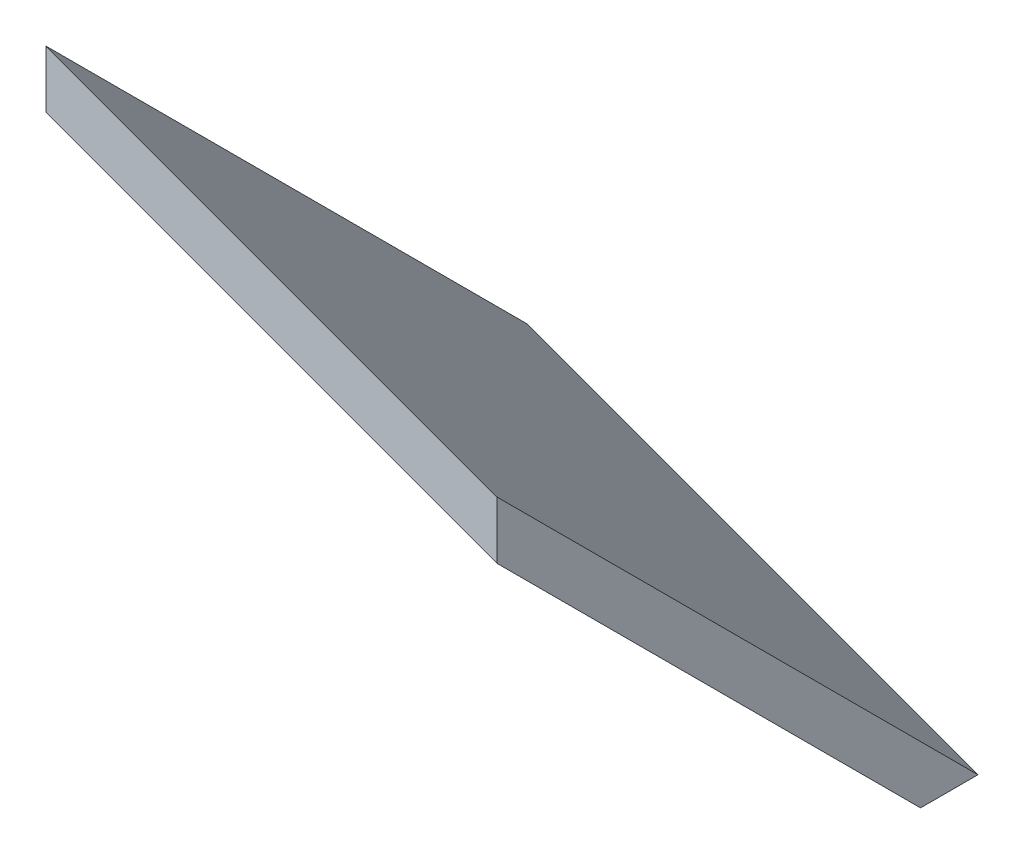
ISO-10303-21;
HEADER;
FILE_DESCRIPTION(('STEP AP214'),'2;1');
FILE_NAME('part.step','',(''),(''),'','','');
FILE_SCHEMA(('AUTOMOTIVE_DESIGN { 1 0 10303 214 1 1 1 1 }'));
ENDSEC;
DATA;
#1=APPLICATION_CONTEXT('core data for automotive mechanical design processes');
#2=APPLICATION_PROTOCOL_DEFINITION('international standard','automotive_design',2000,#1);
#3=PRODUCT_CONTEXT('',#1,'mechanical');
#4=PRODUCT('Part','Part','',(#3));
#5=PRODUCT_RELATED_PRODUCT_CATEGORY('part','',(#4));
#6=PRODUCT_DEFINITION_FORMATION('','',#4);
#7=PRODUCT_DEFINITION_CONTEXT('part definition',#1,'design');
#8=PRODUCT_DEFINITION('design','',#6,#7);
#9=PRODUCT_DEFINITION_SHAPE('','',#8);
#10=(LENGTH_UNIT() NAMED_UNIT(*) SI_UNIT(.MILLI.,.METRE.));
#11=(NAMED_UNIT(*) PLANE_ANGLE_UNIT() SI_UNIT($,.RADIAN.));
#12=(NAMED_UNIT(*) SI_UNIT($,.STERADIAN.) SOLID_ANGLE_UNIT());
#13=UNCERTAINTY_MEASURE_WITH_UNIT(LENGTH_MEASURE(1.E-05),#10,'distance_accuracy_value','');
#14=(GEOMETRIC_REPRESENTATION_CONTEXT(3) GLOBAL_UNCERTAINTY_ASSIGNED_CONTEXT((#13)) GLOBAL_UNIT_ASSIGNED_CONTEXT((#10,
#11,#12)) REPRESENTATION_CONTEXT('',''));
#15=CARTESIAN_POINT('',(0.,0.,0.));
#16=DIRECTION('',(0.,0.,1.));
#17=DIRECTION('',(1.,0.,0.));
#18=AXIS2_PLACEMENT_3D('',#15,#16,#17);
#19=CARTESIAN_POINT('',(0.,0.,0.));
#20=DIRECTION('',(1.,0.,0.));
#21=DIRECTION('',(0.,0.,-1.));
#22=AXIS2_PLACEMENT_3D('',#19,#20,#21);
#23=PLANE('',#22);
#24=DIRECTION('',(0.,-1.,0.));
#25=VECTOR('',#24,1.);
#26=CARTESIAN_POINT('',(0.,129.8,0.));
#27=LINE('',#26,#25);
#28=CARTESIAN_POINT('',(0.,129.8,0.));
#29=VERTEX_POINT('',#28);
#30=CARTESIAN_POINT('',(0.,114.3,0.));
#31=VERTEX_POINT('',#30);
#32=EDGE_CURVE('E92',#29,#31,#27,.T.);
#33=ORIENTED_EDGE('',*,*,#32,.T.);
#34=DIRECTION('',(0.,-0.707106781186547,-0.707106781186548));
#35=VECTOR('',#34,1.);
#36=CARTESIAN_POINT('',(0.,114.3,0.));
#37=LINE('',#36,#35);
#38=CARTESIAN_POINT('',(0.,0.,-114.3));
#39=VERTEX_POINT('',#38);
#40=EDGE_CURVE('E85',#31,#39,#37,.T.);
#41=ORIENTED_EDGE('',*,*,#40,.T.);
#42=DIRECTION('',(0.,0.,-1.));
#43=VECTOR('',#42,1.);
#44=CARTESIAN_POINT('',(0.,0.,-114.3));
#45=LINE('',#44,#43);
#46=CARTESIAN_POINT('',(0.,0.,-129.8));
#47=VERTEX_POINT('',#46);
#48=EDGE_CURVE('E80',#39,#47,#45,.T.);
#49=ORIENTED_EDGE('',*,*,#48,.T.);
#50=DIRECTION('',(0.,0.707106781186547,0.707106781186548));
#51=VECTOR('',#50,1.);
#52=CARTESIAN_POINT('',(0.,0.,-129.8));
#53=LINE('',#52,#51);
#54=EDGE_CURVE('E75',#47,#29,#53,.T.);
#55=ORIENTED_EDGE('',*,*,#54,.T.);
#56=EDGE_LOOP('',(#33,#41,#49,#55));
#57=FACE_BOUND('',#56,.T.);
#58=ADVANCED_FACE('F39',(#57),#23,.T.);
#59=CARTESIAN_POINT('',(-166.13924212172,0.,-44.5168757576337));
#60=DIRECTION('',(1.,0.,0.));
#61=DIRECTION('',(0.,0.,-1.));
#62=AXIS2_PLACEMENT_3D('',#59,#60,#61);
#63=PLANE('',#62);
#64=DIRECTION('',(0.,-1.,0.));
#65=VECTOR('',#64,1.);
#66=CARTESIAN_POINT('',(-166.13924212172,129.8,-44.5168757576336));
#67=LINE('',#66,#65);
#68=CARTESIAN_POINT('',(-166.13924212172,129.8,-44.5168757576336));
#69=VERTEX_POINT('',#68);
#70=CARTESIAN_POINT('',(-166.13924212172,114.3,-44.5168757576337));
#71=VERTEX_POINT('',#70);
#72=EDGE_CURVE('E103',#69,#71,#67,.T.);
#73=ORIENTED_EDGE('',*,*,#72,.F.);
#74=DIRECTION('',(0.,0.707106781186547,0.707106781186548));
#75=VECTOR('',#74,1.);
#76=CARTESIAN_POINT('',(-166.13924212172,0.,-174.316875757634));
#77=LINE('',#76,#75);
#78=CARTESIAN_POINT('',(-166.13924212172,0.,-174.316875757634));
#79=VERTEX_POINT('',#78);
#80=EDGE_CURVE('E11',#79,#69,#77,.T.);
#81=ORIENTED_EDGE('',*,*,#80,.F.);
#82=DIRECTION('',(0.,0.,-1.));
#83=VECTOR('',#82,1.);
#84=CARTESIAN_POINT('',(-166.13924212172,0.,-158.816875757634));
#85=LINE('',#84,#83);
#86=CARTESIAN_POINT('',(-166.13924212172,0.,-158.816875757634));
#87=VERTEX_POINT('',#86);
#88=EDGE_CURVE('E54',#87,#79,#85,.T.);
#89=ORIENTED_EDGE('',*,*,#88,.F.);
#90=DIRECTION('',(0.,-0.707106781186547,-0.707106781186548));
#91=VECTOR('',#90,1.);
#92=CARTESIAN_POINT('',(-166.13924212172,114.3,-44.5168757576337));
#93=LINE('',#92,#91);
#94=EDGE_CURVE('E63',#71,#87,#93,.T.);
#95=ORIENTED_EDGE('',*,*,#94,.F.);
#96=EDGE_LOOP('',(#73,#81,#89,#95));
#97=FACE_BOUND('',#96,.T.);
#98=ADVANCED_FACE('F132',(#97),#63,.F.);
#99=CARTESIAN_POINT('',(0.,129.8,0.));
#100=DIRECTION('',(0.258819045102521,0.,-0.965925826289068));
#101=DIRECTION('',(-0.965925826289068,0.,-0.258819045102521));
#102=AXIS2_PLACEMENT_3D('',#99,#100,#101);
#103=PLANE('',#102);
#104=DIRECTION('',(-0.965925826289068,0.,-0.258819045102521));
#105=VECTOR('',#104,1.);
#106=CARTESIAN_POINT('',(0.,114.3,0.));
#107=LINE('',#106,#105);
#108=EDGE_CURVE('E95',#31,#71,#107,.T.);
#109=ORIENTED_EDGE('',*,*,#108,.F.);
#110=ORIENTED_EDGE('',*,*,#32,.F.);
#111=DIRECTION('',(-0.965925826289068,0.,-0.258819045102521));
#112=VECTOR('',#111,1.);
#113=CARTESIAN_POINT('',(0.,129.8,0.));
#114=LINE('',#113,#112);
#115=EDGE_CURVE('E94',#29,#69,#114,.T.);
#116=ORIENTED_EDGE('',*,*,#115,.T.);
#117=ORIENTED_EDGE('',*,*,#72,.T.);
#118=EDGE_LOOP('',(#109,#110,#116,#117));
#119=FACE_BOUND('',#118,.T.);
#120=ADVANCED_FACE('F93',(#119),#103,.F.);
#121=CARTESIAN_POINT('',(0.,114.3,0.));
#122=DIRECTION('',(0.186156787897386,0.694746590606866,-0.694746590606866));
#123=DIRECTION('',(0.,0.707106781186547,0.707106781186548));
#124=AXIS2_PLACEMENT_3D('',#121,#122,#123);
#125=PLANE('',#124);
#126=DIRECTION('',(-0.965925826289068,0.,-0.258819045102521));
#127=VECTOR('',#126,1.);
#128=CARTESIAN_POINT('',(0.,0.,-114.3));
#129=LINE('',#128,#127);
#130=EDGE_CURVE('E113',#39,#87,#129,.T.);
#131=ORIENTED_EDGE('',*,*,#130,.F.);
#132=ORIENTED_EDGE('',*,*,#40,.F.);
#133=ORIENTED_EDGE('',*,*,#108,.T.);
#134=ORIENTED_EDGE('',*,*,#94,.T.);
#135=EDGE_LOOP('',(#131,#132,#133,#134));
#136=FACE_BOUND('',#135,.T.);
#137=ADVANCED_FACE('F123',(#136),#125,.F.);
#138=CARTESIAN_POINT('',(0.,0.,-114.3));
#139=DIRECTION('',(0.,1.,0.));
#140=DIRECTION('',(0.,0.,1.));
#141=AXIS2_PLACEMENT_3D('',#138,#139,#140);
#142=PLANE('',#141);
#143=DIRECTION('',(-0.965925826289068,0.,-0.258819045102521));
#144=VECTOR('',#143,1.);
#145=CARTESIAN_POINT('',(0.,0.,-129.8));
#146=LINE('',#145,#144);
#147=EDGE_CURVE('E47',#47,#79,#146,.T.);
#148=ORIENTED_EDGE('',*,*,#147,.F.);
#149=ORIENTED_EDGE('',*,*,#48,.F.);
#150=ORIENTED_EDGE('',*,*,#130,.T.);
#151=ORIENTED_EDGE('',*,*,#88,.T.);
#152=EDGE_LOOP('',(#148,#149,#150,#151));
#153=FACE_BOUND('',#152,.T.);
#154=ADVANCED_FACE('F121',(#153),#142,.F.);
#155=CARTESIAN_POINT('',(0.,0.,-129.8));
#156=DIRECTION('',(-0.186156787897386,-0.694746590606866,0.694746590606866));
#157=DIRECTION('',(0.,-0.707106781186547,-0.707106781186548));
#158=AXIS2_PLACEMENT_3D('',#155,#156,#157);
#159=PLANE('',#158);
#160=ORIENTED_EDGE('',*,*,#80,.T.);
#161=ORIENTED_EDGE('',*,*,#115,.F.);
#162=ORIENTED_EDGE('',*,*,#54,.F.);
#163=ORIENTED_EDGE('',*,*,#147,.T.);
#164=EDGE_LOOP('',(#160,#161,#162,#163));
#165=FACE_BOUND('',#164,.T.);
#166=ADVANCED_FACE('F100',(#165),#159,.F.);
#167=CLOSED_SHELL('',(#58,#98,#120,#137,#154,#166));
#168=MANIFOLD_SOLID_BREP('B2',#167);
#169=ADVANCED_BREP_SHAPE_REPRESENTATION('',(#18,#168),#14);
#170=SHAPE_DEFINITION_REPRESENTATION(#9,#169);
ENDSEC;
END-ISO-10303-21;
